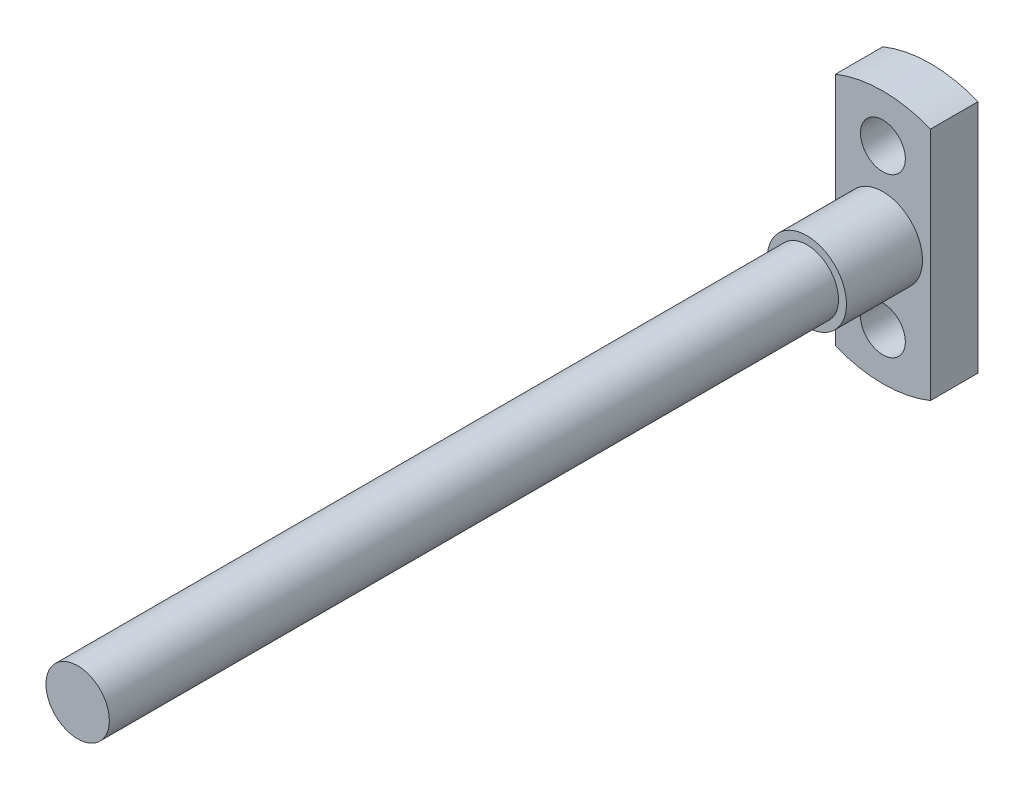
ISO-10303-21;
HEADER;
FILE_DESCRIPTION(('STEP AP214'),'2;1');
FILE_NAME('part.step','',(''),(''),'','','');
FILE_SCHEMA(('AUTOMOTIVE_DESIGN { 1 0 10303 214 1 1 1 1 }'));
ENDSEC;
DATA;
#1=APPLICATION_CONTEXT('core data for automotive mechanical design processes');
#2=APPLICATION_PROTOCOL_DEFINITION('international standard','automotive_design',2000,#1);
#3=PRODUCT_CONTEXT('',#1,'mechanical');
#4=PRODUCT('Part','Part','',(#3));
#5=PRODUCT_RELATED_PRODUCT_CATEGORY('part','',(#4));
#6=PRODUCT_DEFINITION_FORMATION('','',#4);
#7=PRODUCT_DEFINITION_CONTEXT('part definition',#1,'design');
#8=PRODUCT_DEFINITION('design','',#6,#7);
#9=PRODUCT_DEFINITION_SHAPE('','',#8);
#10=(LENGTH_UNIT() NAMED_UNIT(*) SI_UNIT(.MILLI.,.METRE.));
#11=(NAMED_UNIT(*) PLANE_ANGLE_UNIT() SI_UNIT($,.RADIAN.));
#12=(NAMED_UNIT(*) SI_UNIT($,.STERADIAN.) SOLID_ANGLE_UNIT());
#13=UNCERTAINTY_MEASURE_WITH_UNIT(LENGTH_MEASURE(1.E-05),#10,'distance_accuracy_value','');
#14=(GEOMETRIC_REPRESENTATION_CONTEXT(3) GLOBAL_UNCERTAINTY_ASSIGNED_CONTEXT((#13)) GLOBAL_UNIT_ASSIGNED_CONTEXT((#10,
#11,#12)) REPRESENTATION_CONTEXT('',''));
#15=CARTESIAN_POINT('',(0.,0.,0.));
#16=DIRECTION('',(0.,0.,1.));
#17=DIRECTION('',(1.,0.,0.));
#18=AXIS2_PLACEMENT_3D('',#15,#16,#17);
#19=CARTESIAN_POINT('',(4.7625,11.7732150982644,12.3825));
#20=DIRECTION('',(0.,0.,1.));
#21=DIRECTION('',(1.,0.,0.));
#22=AXIS2_PLACEMENT_3D('',#19,#20,#21);
#23=PLANE('',#22);
#24=CARTESIAN_POINT('',(4.7625,11.7732150982644,12.3825));
#25=DIRECTION('',(0.,0.,1.));
#26=DIRECTION('',(1.,0.,0.));
#27=AXIS2_PLACEMENT_3D('',#24,#25,#26);
#28=CIRCLE('',#27,3.96875);
#29=CARTESIAN_POINT('',(0.793749999999997,11.7732150982644,12.3825));
#30=VERTEX_POINT('',#29);
#31=EDGE_CURVE('E104',#30,#30,#28,.T.);
#32=ORIENTED_EDGE('',*,*,#31,.T.);
#33=EDGE_LOOP('',(#32));
#34=FACE_BOUND('',#33,.T.);
#35=CARTESIAN_POINT('',(4.7625,11.7732150982644,12.3825));
#36=DIRECTION('',(0.,0.,1.));
#37=DIRECTION('',(1.,0.,0.));
#38=AXIS2_PLACEMENT_3D('',#35,#36,#37);
#39=CIRCLE('',#38,3.175);
#40=CARTESIAN_POINT('',(7.9375,11.7732150982644,12.3825));
#41=VERTEX_POINT('',#40);
#42=EDGE_CURVE('E170',#41,#41,#39,.T.);
#43=ORIENTED_EDGE('',*,*,#42,.F.);
#44=EDGE_LOOP('',(#43));
#45=FACE_BOUND('',#44,.T.);
#46=ADVANCED_FACE('F33',(#34,#45),#23,.T.);
#47=CARTESIAN_POINT('',(4.7625,11.7732150982644,4.7625));
#48=DIRECTION('',(0.,0.,-1.));
#49=DIRECTION('',(-1.,0.,0.));
#50=AXIS2_PLACEMENT_3D('',#47,#48,#49);
#51=PLANE('',#50);
#52=CARTESIAN_POINT('',(4.7625,3.83571509826437,4.7625));
#53=DIRECTION('',(0.,0.,1.));
#54=DIRECTION('',(1.,0.,0.));
#55=AXIS2_PLACEMENT_3D('',#52,#53,#54);
#56=CIRCLE('',#55,2.24789999999999);
#57=CARTESIAN_POINT('',(7.01039999999999,3.83571509826437,4.7625));
#58=VERTEX_POINT('',#57);
#59=EDGE_CURVE('E160',#58,#58,#56,.T.);
#60=ORIENTED_EDGE('',*,*,#59,.F.);
#61=EDGE_LOOP('',(#60));
#62=FACE_BOUND('',#61,.T.);
#63=CARTESIAN_POINT('',(4.7625,19.7107150982644,4.7625));
#64=DIRECTION('',(0.,0.,1.));
#65=DIRECTION('',(1.,0.,0.));
#66=AXIS2_PLACEMENT_3D('',#63,#64,#65);
#67=CIRCLE('',#66,2.24789999999999);
#68=CARTESIAN_POINT('',(7.01039999999999,19.7107150982644,4.7625));
#69=VERTEX_POINT('',#68);
#70=EDGE_CURVE('E162',#69,#69,#67,.T.);
#71=ORIENTED_EDGE('',*,*,#70,.F.);
#72=EDGE_LOOP('',(#71));
#73=FACE_BOUND('',#72,.T.);
#74=CARTESIAN_POINT('',(4.7625,11.7732150982644,4.7625));
#75=DIRECTION('',(0.,0.,1.));
#76=DIRECTION('',(-1.,0.,0.));
#77=AXIS2_PLACEMENT_3D('',#74,#75,#76);
#78=CIRCLE('',#77,12.7);
#79=CARTESIAN_POINT('',(0.,0.,4.7625));
#80=VERTEX_POINT('',#79);
#81=CARTESIAN_POINT('',(9.525,0.,4.7625));
#82=VERTEX_POINT('',#81);
#83=EDGE_CURVE('E87',#80,#82,#78,.T.);
#84=ORIENTED_EDGE('',*,*,#83,.T.);
#85=DIRECTION('',(0.,1.,0.));
#86=VECTOR('',#85,1.);
#87=CARTESIAN_POINT('',(9.525,0.,4.7625));
#88=LINE('',#87,#86);
#89=CARTESIAN_POINT('',(9.525,23.5464301965287,4.7625));
#90=VERTEX_POINT('',#89);
#91=EDGE_CURVE('E81',#82,#90,#88,.T.);
#92=ORIENTED_EDGE('',*,*,#91,.T.);
#93=CARTESIAN_POINT('',(4.7625,11.7732150982644,4.7625));
#94=DIRECTION('',(0.,0.,1.));
#95=DIRECTION('',(-1.,0.,0.));
#96=AXIS2_PLACEMENT_3D('',#93,#94,#95);
#97=CIRCLE('',#96,12.7);
#98=CARTESIAN_POINT('',(0.,23.5464301965287,4.7625));
#99=VERTEX_POINT('',#98);
#100=EDGE_CURVE('E85',#90,#99,#97,.T.);
#101=ORIENTED_EDGE('',*,*,#100,.T.);
#102=DIRECTION('',(0.,-1.,0.));
#103=VECTOR('',#102,1.);
#104=CARTESIAN_POINT('',(0.,0.,4.7625));
#105=LINE('',#104,#103);
#106=EDGE_CURVE('E50',#99,#80,#105,.T.);
#107=ORIENTED_EDGE('',*,*,#106,.T.);
#108=EDGE_LOOP('',(#84,#92,#101,#107));
#109=FACE_BOUND('',#108,.T.);
#110=CARTESIAN_POINT('',(4.7625,11.7732150982644,4.7625));
#111=DIRECTION('',(0.,0.,-1.));
#112=DIRECTION('',(-1.,0.,0.));
#113=AXIS2_PLACEMENT_3D('',#110,#111,#112);
#114=CIRCLE('',#113,3.96875);
#115=CARTESIAN_POINT('',(0.793749999999997,11.7732150982644,4.7625));
#116=VERTEX_POINT('',#115);
#117=EDGE_CURVE('E11',#116,#116,#114,.F.);
#118=ORIENTED_EDGE('',*,*,#117,.F.);
#119=EDGE_LOOP('',(#118));
#120=FACE_BOUND('',#119,.T.);
#121=ADVANCED_FACE('F82',(#62,#73,#109,#120),#51,.F.);
#122=CARTESIAN_POINT('',(4.7625,11.7732150982644,4.7625));
#123=DIRECTION('',(0.,0.,-1.));
#124=DIRECTION('',(-1.,0.,0.));
#125=AXIS2_PLACEMENT_3D('',#122,#123,#124);
#126=CYLINDRICAL_SURFACE('',#125,12.7);
#127=CARTESIAN_POINT('',(4.7625,11.7732150982644,0.));
#128=DIRECTION('',(0.,0.,1.));
#129=DIRECTION('',(-1.,0.,0.));
#130=AXIS2_PLACEMENT_3D('',#127,#128,#129);
#131=CIRCLE('',#130,12.7);
#132=CARTESIAN_POINT('',(0.,0.,0.));
#133=VERTEX_POINT('',#132);
#134=CARTESIAN_POINT('',(9.525,0.,0.));
#135=VERTEX_POINT('',#134);
#136=EDGE_CURVE('E101',#133,#135,#131,.T.);
#137=ORIENTED_EDGE('',*,*,#136,.T.);
#138=DIRECTION('',(0.,0.,-1.));
#139=VECTOR('',#138,1.);
#140=CARTESIAN_POINT('',(9.525,0.,4.7625));
#141=LINE('',#140,#139);
#142=EDGE_CURVE('E42',#82,#135,#141,.T.);
#143=ORIENTED_EDGE('',*,*,#142,.F.);
#144=ORIENTED_EDGE('',*,*,#83,.F.);
#145=DIRECTION('',(0.,0.,-1.));
#146=VECTOR('',#145,1.);
#147=CARTESIAN_POINT('',(0.,0.,4.7625));
#148=LINE('',#147,#146);
#149=EDGE_CURVE('E97',#80,#133,#148,.T.);
#150=ORIENTED_EDGE('',*,*,#149,.T.);
#151=EDGE_LOOP('',(#137,#143,#144,#150));
#152=FACE_BOUND('',#151,.T.);
#153=ADVANCED_FACE('F35',(#152),#126,.T.);
#154=CARTESIAN_POINT('',(9.525,0.,4.7625));
#155=DIRECTION('',(-1.,0.,0.));
#156=DIRECTION('',(0.,-1.,0.));
#157=AXIS2_PLACEMENT_3D('',#154,#155,#156);
#158=PLANE('',#157);
#159=DIRECTION('',(0.,1.,0.));
#160=VECTOR('',#159,1.);
#161=CARTESIAN_POINT('',(9.525,0.,0.));
#162=LINE('',#161,#160);
#163=CARTESIAN_POINT('',(9.525,23.5464301965287,0.));
#164=VERTEX_POINT('',#163);
#165=EDGE_CURVE('E92',#135,#164,#162,.T.);
#166=ORIENTED_EDGE('',*,*,#165,.T.);
#167=DIRECTION('',(0.,0.,-1.));
#168=VECTOR('',#167,1.);
#169=CARTESIAN_POINT('',(9.525,23.5464301965287,4.7625));
#170=LINE('',#169,#168);
#171=EDGE_CURVE('E90',#90,#164,#170,.T.);
#172=ORIENTED_EDGE('',*,*,#171,.F.);
#173=ORIENTED_EDGE('',*,*,#91,.F.);
#174=ORIENTED_EDGE('',*,*,#142,.T.);
#175=EDGE_LOOP('',(#166,#172,#173,#174));
#176=FACE_BOUND('',#175,.T.);
#177=ADVANCED_FACE('F91',(#176),#158,.F.);
#178=CARTESIAN_POINT('',(4.7625,11.7732150982644,4.7625));
#179=DIRECTION('',(0.,0.,-1.));
#180=DIRECTION('',(-1.,0.,0.));
#181=AXIS2_PLACEMENT_3D('',#178,#179,#180);
#182=CYLINDRICAL_SURFACE('',#181,12.7);
#183=CARTESIAN_POINT('',(4.7625,11.7732150982644,0.));
#184=DIRECTION('',(0.,0.,1.));
#185=DIRECTION('',(-1.,0.,0.));
#186=AXIS2_PLACEMENT_3D('',#183,#184,#185);
#187=CIRCLE('',#186,12.7);
#188=CARTESIAN_POINT('',(0.,23.5464301965287,0.));
#189=VERTEX_POINT('',#188);
#190=EDGE_CURVE('E67',#164,#189,#187,.T.);
#191=ORIENTED_EDGE('',*,*,#190,.T.);
#192=DIRECTION('',(0.,0.,-1.));
#193=VECTOR('',#192,1.);
#194=CARTESIAN_POINT('',(0.,23.5464301965287,4.7625));
#195=LINE('',#194,#193);
#196=EDGE_CURVE('E93',#99,#189,#195,.T.);
#197=ORIENTED_EDGE('',*,*,#196,.F.);
#198=ORIENTED_EDGE('',*,*,#100,.F.);
#199=ORIENTED_EDGE('',*,*,#171,.T.);
#200=EDGE_LOOP('',(#191,#197,#198,#199));
#201=FACE_BOUND('',#200,.T.);
#202=ADVANCED_FACE('F95',(#201),#182,.T.);
#203=CARTESIAN_POINT('',(0.,0.,4.7625));
#204=DIRECTION('',(1.,0.,0.));
#205=DIRECTION('',(0.,0.,-1.));
#206=AXIS2_PLACEMENT_3D('',#203,#204,#205);
#207=PLANE('',#206);
#208=DIRECTION('',(0.,-1.,0.));
#209=VECTOR('',#208,1.);
#210=CARTESIAN_POINT('',(0.,0.,0.));
#211=LINE('',#210,#209);
#212=EDGE_CURVE('E73',#189,#133,#211,.T.);
#213=ORIENTED_EDGE('',*,*,#212,.T.);
#214=ORIENTED_EDGE('',*,*,#149,.F.);
#215=ORIENTED_EDGE('',*,*,#106,.F.);
#216=ORIENTED_EDGE('',*,*,#196,.T.);
#217=EDGE_LOOP('',(#213,#214,#215,#216));
#218=FACE_BOUND('',#217,.T.);
#219=ADVANCED_FACE('F115',(#218),#207,.F.);
#220=CARTESIAN_POINT('',(4.7625,11.7732150982644,0.));
#221=DIRECTION('',(0.,0.,-1.));
#222=DIRECTION('',(-1.,0.,0.));
#223=AXIS2_PLACEMENT_3D('',#220,#221,#222);
#224=PLANE('',#223);
#225=CARTESIAN_POINT('',(4.7625,3.83571509826437,0.));
#226=DIRECTION('',(0.,0.,1.));
#227=DIRECTION('',(1.,0.,0.));
#228=AXIS2_PLACEMENT_3D('',#225,#226,#227);
#229=CIRCLE('',#228,2.2479);
#230=CARTESIAN_POINT('',(7.0104,3.83571509826437,0.));
#231=VERTEX_POINT('',#230);
#232=EDGE_CURVE('E157',#231,#231,#229,.T.);
#233=ORIENTED_EDGE('',*,*,#232,.T.);
#234=EDGE_LOOP('',(#233));
#235=FACE_BOUND('',#234,.T.);
#236=CARTESIAN_POINT('',(4.7625,19.7107150982644,0.));
#237=DIRECTION('',(0.,0.,1.));
#238=DIRECTION('',(1.,0.,0.));
#239=AXIS2_PLACEMENT_3D('',#236,#237,#238);
#240=CIRCLE('',#239,2.2479);
#241=CARTESIAN_POINT('',(7.0104,19.7107150982644,0.));
#242=VERTEX_POINT('',#241);
#243=EDGE_CURVE('E167',#242,#242,#240,.T.);
#244=ORIENTED_EDGE('',*,*,#243,.T.);
#245=EDGE_LOOP('',(#244));
#246=FACE_BOUND('',#245,.T.);
#247=ORIENTED_EDGE('',*,*,#136,.F.);
#248=ORIENTED_EDGE('',*,*,#212,.F.);
#249=ORIENTED_EDGE('',*,*,#190,.F.);
#250=ORIENTED_EDGE('',*,*,#165,.F.);
#251=EDGE_LOOP('',(#247,#248,#249,#250));
#252=FACE_BOUND('',#251,.T.);
#253=ADVANCED_FACE('F112',(#235,#246,#252),#224,.T.);
#254=CARTESIAN_POINT('',(4.7625,11.7732150982644,12.3825));
#255=DIRECTION('',(0.,0.,-1.));
#256=DIRECTION('',(-1.,0.,0.));
#257=AXIS2_PLACEMENT_3D('',#254,#255,#256);
#258=CYLINDRICAL_SURFACE('',#257,3.96875);
#259=CARTESIAN_POINT('',(0.793749999999997,11.7732150982644,12.3825));
#260=CARTESIAN_POINT('',(0.793749999999997,11.7732150982644,12.303125));
#261=CARTESIAN_POINT('',(0.793749999999997,11.7732150982644,12.22375));
#262=CARTESIAN_POINT('',(0.793749999999997,11.7732150982644,12.065));
#263=CARTESIAN_POINT('',(0.793749999999997,11.7732150982644,11.985625));
#264=CARTESIAN_POINT('',(0.793749999999997,11.7732150982644,11.826875));
#265=CARTESIAN_POINT('',(0.793749999999997,11.7732150982644,11.7475));
#266=CARTESIAN_POINT('',(0.793749999999997,11.7732150982644,11.58875));
#267=CARTESIAN_POINT('',(0.793749999999997,11.7732150982644,11.509375));
#268=CARTESIAN_POINT('',(0.793749999999997,11.7732150982644,11.350625));
#269=CARTESIAN_POINT('',(0.793749999999997,11.7732150982644,11.27125));
#270=CARTESIAN_POINT('',(0.793749999999997,11.7732150982644,11.1125));
#271=CARTESIAN_POINT('',(0.793749999999997,11.7732150982644,11.033125));
#272=CARTESIAN_POINT('',(0.793749999999997,11.7732150982644,10.874375));
#273=CARTESIAN_POINT('',(0.793749999999997,11.7732150982644,10.795));
#274=CARTESIAN_POINT('',(0.793749999999997,11.7732150982644,10.63625));
#275=CARTESIAN_POINT('',(0.793749999999997,11.7732150982644,10.556875));
#276=CARTESIAN_POINT('',(0.793749999999997,11.7732150982644,10.398125));
#277=CARTESIAN_POINT('',(0.793749999999997,11.7732150982644,10.31875));
#278=CARTESIAN_POINT('',(0.793749999999997,11.7732150982644,10.16));
#279=CARTESIAN_POINT('',(0.793749999999997,11.7732150982644,10.080625));
#280=CARTESIAN_POINT('',(0.793749999999997,11.7732150982644,9.921875));
#281=CARTESIAN_POINT('',(0.793749999999997,11.7732150982644,9.8425));
#282=CARTESIAN_POINT('',(0.793749999999997,11.7732150982644,9.68375));
#283=CARTESIAN_POINT('',(0.793749999999997,11.7732150982644,9.604375));
#284=CARTESIAN_POINT('',(0.793749999999997,11.7732150982644,9.445625));
#285=CARTESIAN_POINT('',(0.793749999999997,11.7732150982644,9.36625));
#286=CARTESIAN_POINT('',(0.793749999999997,11.7732150982644,9.2075));
#287=CARTESIAN_POINT('',(0.793749999999997,11.7732150982644,9.128125));
#288=CARTESIAN_POINT('',(0.793749999999997,11.7732150982644,8.969375));
#289=CARTESIAN_POINT('',(0.793749999999997,11.7732150982644,8.89));
#290=CARTESIAN_POINT('',(0.793749999999997,11.7732150982644,8.73125));
#291=CARTESIAN_POINT('',(0.793749999999997,11.7732150982644,8.651875));
#292=CARTESIAN_POINT('',(0.793749999999997,11.7732150982644,8.493125));
#293=CARTESIAN_POINT('',(0.793749999999997,11.7732150982644,8.41375));
#294=CARTESIAN_POINT('',(0.793749999999997,11.7732150982644,8.255));
#295=CARTESIAN_POINT('',(0.793749999999997,11.7732150982644,8.175625));
#296=CARTESIAN_POINT('',(0.793749999999997,11.7732150982644,8.016875));
#297=CARTESIAN_POINT('',(0.793749999999997,11.7732150982644,7.9375));
#298=CARTESIAN_POINT('',(0.793749999999997,11.7732150982644,7.77875));
#299=CARTESIAN_POINT('',(0.793749999999997,11.7732150982644,7.699375));
#300=CARTESIAN_POINT('',(0.793749999999997,11.7732150982644,7.540625));
#301=CARTESIAN_POINT('',(0.793749999999997,11.7732150982644,7.46125));
#302=CARTESIAN_POINT('',(0.793749999999997,11.7732150982644,7.3025));
#303=CARTESIAN_POINT('',(0.793749999999997,11.7732150982644,7.223125));
#304=CARTESIAN_POINT('',(0.793749999999997,11.7732150982644,7.064375));
#305=CARTESIAN_POINT('',(0.793749999999997,11.7732150982644,6.985));
#306=CARTESIAN_POINT('',(0.793749999999997,11.7732150982644,6.82625));
#307=CARTESIAN_POINT('',(0.793749999999997,11.7732150982644,6.746875));
#308=CARTESIAN_POINT('',(0.793749999999997,11.7732150982644,6.588125));
#309=CARTESIAN_POINT('',(0.793749999999997,11.7732150982644,6.50875));
#310=CARTESIAN_POINT('',(0.793749999999997,11.7732150982644,6.35));
#311=CARTESIAN_POINT('',(0.793749999999997,11.7732150982644,6.270625));
#312=CARTESIAN_POINT('',(0.793749999999997,11.7732150982644,6.111875));
#313=CARTESIAN_POINT('',(0.793749999999997,11.7732150982644,6.0325));
#314=CARTESIAN_POINT('',(0.793749999999997,11.7732150982644,5.87375));
#315=CARTESIAN_POINT('',(0.793749999999997,11.7732150982644,5.794375));
#316=CARTESIAN_POINT('',(0.793749999999997,11.7732150982644,5.635625));
#317=CARTESIAN_POINT('',(0.793749999999997,11.7732150982644,5.55625));
#318=CARTESIAN_POINT('',(0.793749999999997,11.7732150982644,5.3975));
#319=CARTESIAN_POINT('',(0.793749999999997,11.7732150982644,5.318125));
#320=CARTESIAN_POINT('',(0.793749999999997,11.7732150982644,5.159375));
#321=CARTESIAN_POINT('',(0.793749999999997,11.7732150982644,5.08));
#322=CARTESIAN_POINT('',(0.793749999999997,11.7732150982644,4.92125));
#323=CARTESIAN_POINT('',(0.793749999999997,11.7732150982644,4.841875));
#324=CARTESIAN_POINT('',(0.793749999999997,11.7732150982644,4.7625));
#325=B_SPLINE_CURVE_WITH_KNOTS('',3,(#259,#260,#261,#262,#263,#264,#265,#266,#267,#268,#269,
#270,#271,#272,#273,#274,#275,#276,#277,#278,#279,#280,#281,#282,#283,#284,#285,#286,#287,#288,
#289,#290,#291,#292,#293,#294,#295,#296,#297,#298,#299,#300,#301,#302,#303,#304,#305,#306,#307,
#308,#309,#310,#311,#312,#313,#314,#315,#316,#317,#318,#319,#320,#321,#322,#323,#324),
.UNSPECIFIED.,.F.,.F.,(4,2,2,2,2,2,2,2,2,2,2,2,2,2,2,2,2,2,2,2,2,2,2,2,2,2,2,2,2,2,2,2,4),(0.,
0.238124999999999,0.476249999999999,0.714375,0.952499999999998,1.190625,1.42875,1.666875,1.905,
2.143125,2.38125,2.619375,2.8575,3.095625,3.33375,3.571875,3.81,4.048125,4.28625,4.524375,
4.7625,5.000625,5.23875,5.476875,5.715,5.953125,6.19125,6.429375,6.6675,6.905625,7.14375,
7.381875,7.62),.UNSPECIFIED.);
#326=EDGE_CURVE('BSEAM114',#30,#116,#325,.T.);
#327=ORIENTED_EDGE('',*,*,#31,.F.);
#328=ORIENTED_EDGE('',*,*,#117,.T.);
#329=ORIENTED_EDGE('',*,*,#326,.T.);
#330=ORIENTED_EDGE('',*,*,#326,.F.);
#331=EDGE_LOOP('',(#327,#329,#328,#330));
#332=FACE_BOUND('',#331,.T.);
#333=ADVANCED_FACE('F114',(#332),#258,.T.);
#334=CARTESIAN_POINT('',(4.7625,11.7732150982644,85.4075));
#335=DIRECTION('',(0.,0.,-1.));
#336=DIRECTION('',(-1.,0.,0.));
#337=AXIS2_PLACEMENT_3D('',#334,#335,#336);
#338=CYLINDRICAL_SURFACE('',#337,3.175);
#339=CARTESIAN_POINT('',(4.7625,11.7732150982644,85.4075));
#340=DIRECTION('',(0.,0.,1.));
#341=DIRECTION('',(1.,0.,0.));
#342=AXIS2_PLACEMENT_3D('',#339,#340,#341);
#343=CIRCLE('',#342,3.175);
#344=CARTESIAN_POINT('',(7.9375,11.7732150982644,85.4075));
#345=VERTEX_POINT('',#344);
#346=EDGE_CURVE('E171',#345,#345,#343,.T.);
#347=ORIENTED_EDGE('',*,*,#346,.F.);
#348=EDGE_LOOP('',(#347));
#349=FACE_BOUND('',#348,.T.);
#350=ORIENTED_EDGE('',*,*,#42,.T.);
#351=EDGE_LOOP('',(#350));
#352=FACE_BOUND('',#351,.T.);
#353=ADVANCED_FACE('F122',(#349,#352),#338,.T.);
#354=CARTESIAN_POINT('',(4.7625,11.7732150982644,85.4075));
#355=DIRECTION('',(0.,0.,1.));
#356=DIRECTION('',(1.,0.,0.));
#357=AXIS2_PLACEMENT_3D('',#354,#355,#356);
#358=PLANE('',#357);
#359=ORIENTED_EDGE('',*,*,#346,.T.);
#360=EDGE_LOOP('',(#359));
#361=FACE_BOUND('',#360,.T.);
#362=ADVANCED_FACE('F141',(#361),#358,.T.);
#363=CARTESIAN_POINT('',(4.7625,19.7107150982644,4.7625));
#364=DIRECTION('',(0.,0.,1.));
#365=DIRECTION('',(1.,0.,0.));
#366=AXIS2_PLACEMENT_3D('',#363,#364,#365);
#367=CYLINDRICAL_SURFACE('',#366,2.24789999999999);
#368=ORIENTED_EDGE('',*,*,#243,.F.);
#369=EDGE_LOOP('',(#368));
#370=FACE_BOUND('',#369,.T.);
#371=ORIENTED_EDGE('',*,*,#70,.T.);
#372=EDGE_LOOP('',(#371));
#373=FACE_BOUND('',#372,.T.);
#374=ADVANCED_FACE('F145',(#370,#373),#367,.F.);
#375=CARTESIAN_POINT('',(4.7625,3.83571509826437,4.7625));
#376=DIRECTION('',(0.,0.,1.));
#377=DIRECTION('',(1.,0.,0.));
#378=AXIS2_PLACEMENT_3D('',#375,#376,#377);
#379=CYLINDRICAL_SURFACE('',#378,2.24789999999999);
#380=ORIENTED_EDGE('',*,*,#232,.F.);
#381=EDGE_LOOP('',(#380));
#382=FACE_BOUND('',#381,.T.);
#383=ORIENTED_EDGE('',*,*,#59,.T.);
#384=EDGE_LOOP('',(#383));
#385=FACE_BOUND('',#384,.T.);
#386=ADVANCED_FACE('F149',(#382,#385),#379,.F.);
#387=CLOSED_SHELL('',(#46,#121,#153,#177,#202,#219,#253,#333,#353,#362,#374,#386));
#388=MANIFOLD_SOLID_BREP('B2',#387);
#389=ADVANCED_BREP_SHAPE_REPRESENTATION('',(#18,#388),#14);
#390=SHAPE_DEFINITION_REPRESENTATION(#9,#389);
ENDSEC;
END-ISO-10303-21;
